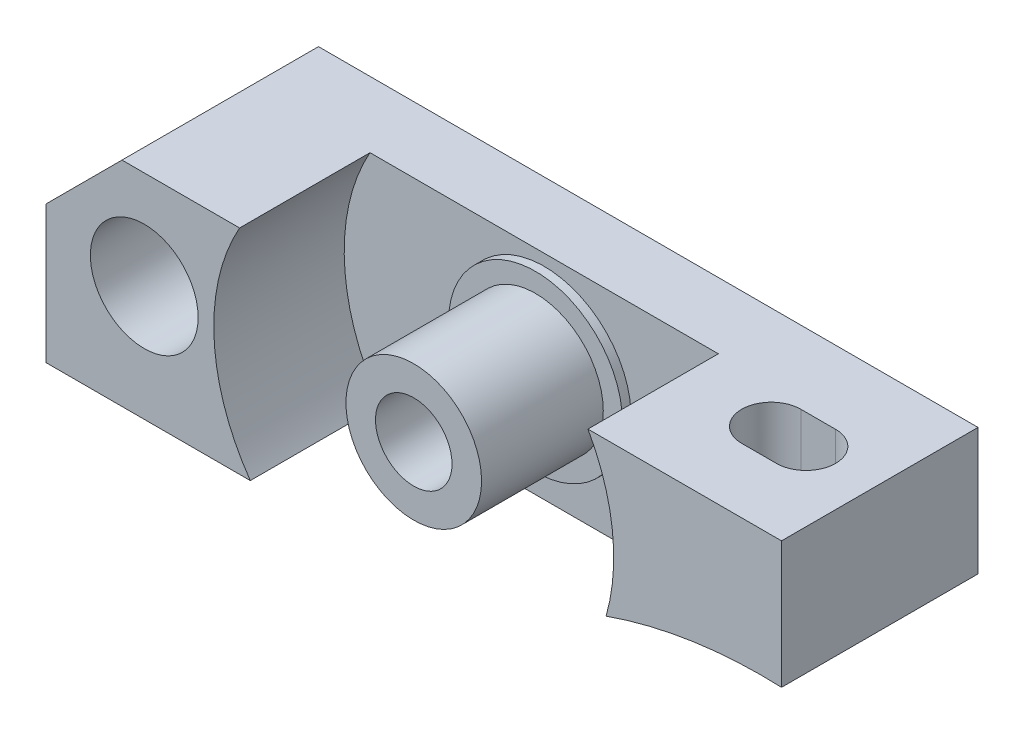
ISO-10303-21;
HEADER;
FILE_DESCRIPTION(('STEP AP214'),'2;1');
FILE_NAME('part.step','',(''),(''),'','','');
FILE_SCHEMA(('AUTOMOTIVE_DESIGN { 1 0 10303 214 1 1 1 1 }'));
ENDSEC;
DATA;
#1=APPLICATION_CONTEXT('core data for automotive mechanical design processes');
#2=APPLICATION_PROTOCOL_DEFINITION('international standard','automotive_design',2000,#1);
#3=PRODUCT_CONTEXT('',#1,'mechanical');
#4=PRODUCT('Part','Part','',(#3));
#5=PRODUCT_RELATED_PRODUCT_CATEGORY('part','',(#4));
#6=PRODUCT_DEFINITION_FORMATION('','',#4);
#7=PRODUCT_DEFINITION_CONTEXT('part definition',#1,'design');
#8=PRODUCT_DEFINITION('design','',#6,#7);
#9=PRODUCT_DEFINITION_SHAPE('','',#8);
#10=(LENGTH_UNIT() NAMED_UNIT(*) SI_UNIT(.MILLI.,.METRE.));
#11=(NAMED_UNIT(*) PLANE_ANGLE_UNIT() SI_UNIT($,.RADIAN.));
#12=(NAMED_UNIT(*) SI_UNIT($,.STERADIAN.) SOLID_ANGLE_UNIT());
#13=UNCERTAINTY_MEASURE_WITH_UNIT(LENGTH_MEASURE(1.E-05),#10,'distance_accuracy_value','');
#14=(GEOMETRIC_REPRESENTATION_CONTEXT(3) GLOBAL_UNCERTAINTY_ASSIGNED_CONTEXT((#13)) GLOBAL_UNIT_ASSIGNED_CONTEXT((#10,
#11,#12)) REPRESENTATION_CONTEXT('',''));
#15=CARTESIAN_POINT('',(0.,0.,0.));
#16=DIRECTION('',(0.,0.,1.));
#17=DIRECTION('',(1.,0.,0.));
#18=AXIS2_PLACEMENT_3D('',#15,#16,#17);
#19=CARTESIAN_POINT('',(-15.5,0.4875,3.8));
#20=DIRECTION('',(0.,0.,-1.));
#21=DIRECTION('',(-1.,0.,0.));
#22=AXIS2_PLACEMENT_3D('',#19,#20,#21);
#23=CYLINDRICAL_SURFACE('',#22,1.725);
#24=CARTESIAN_POINT('',(-15.5,0.4875,0.));
#25=DIRECTION('',(0.,0.,1.));
#26=DIRECTION('',(1.,0.,0.));
#27=AXIS2_PLACEMENT_3D('',#24,#25,#26);
#28=CIRCLE('',#27,1.725);
#29=CARTESIAN_POINT('',(-17.225,0.4875,0.));
#30=VERTEX_POINT('',#29);
#31=EDGE_CURVE('E235',#30,#30,#28,.T.);
#32=CARTESIAN_POINT('',(-15.5,0.4875,5.65));
#33=DIRECTION('',(0.,0.,1.));
#34=DIRECTION('',(1.,0.,0.));
#35=AXIS2_PLACEMENT_3D('',#32,#33,#34);
#36=CIRCLE('',#35,1.725);
#37=CARTESIAN_POINT('',(-17.225,0.4875,5.65));
#38=VERTEX_POINT('',#37);
#39=EDGE_CURVE('E202',#38,#38,#36,.T.);
#40=CARTESIAN_POINT('',(-17.225,0.4875,0.));
#41=CARTESIAN_POINT('',(-17.225,0.4875,0.0588541666666667));
#42=CARTESIAN_POINT('',(-17.225,0.4875,0.117708333333333));
#43=CARTESIAN_POINT('',(-17.225,0.4875,0.235416666666667));
#44=CARTESIAN_POINT('',(-17.225,0.4875,0.294270833333333));
#45=CARTESIAN_POINT('',(-17.225,0.4875,0.411979166666667));
#46=CARTESIAN_POINT('',(-17.225,0.4875,0.470833333333333));
#47=CARTESIAN_POINT('',(-17.225,0.4875,0.588541666666667));
#48=CARTESIAN_POINT('',(-17.225,0.4875,0.647395833333334));
#49=CARTESIAN_POINT('',(-17.225,0.4875,0.765104166666667));
#50=CARTESIAN_POINT('',(-17.225,0.4875,0.823958333333333));
#51=CARTESIAN_POINT('',(-17.225,0.4875,0.941666666666667));
#52=CARTESIAN_POINT('',(-17.225,0.4875,1.00052083333333));
#53=CARTESIAN_POINT('',(-17.225,0.4875,1.11822916666667));
#54=CARTESIAN_POINT('',(-17.225,0.4875,1.17708333333333));
#55=CARTESIAN_POINT('',(-17.225,0.4875,1.29479166666667));
#56=CARTESIAN_POINT('',(-17.225,0.4875,1.35364583333333));
#57=CARTESIAN_POINT('',(-17.225,0.4875,1.47135416666667));
#58=CARTESIAN_POINT('',(-17.225,0.4875,1.53020833333333));
#59=CARTESIAN_POINT('',(-17.225,0.4875,1.64791666666667));
#60=CARTESIAN_POINT('',(-17.225,0.4875,1.70677083333333));
#61=CARTESIAN_POINT('',(-17.225,0.4875,1.82447916666667));
#62=CARTESIAN_POINT('',(-17.225,0.4875,1.88333333333333));
#63=CARTESIAN_POINT('',(-17.225,0.4875,2.00104166666667));
#64=CARTESIAN_POINT('',(-17.225,0.4875,2.05989583333333));
#65=CARTESIAN_POINT('',(-17.225,0.4875,2.17760416666667));
#66=CARTESIAN_POINT('',(-17.225,0.4875,2.23645833333333));
#67=CARTESIAN_POINT('',(-17.225,0.4875,2.35416666666667));
#68=CARTESIAN_POINT('',(-17.225,0.4875,2.41302083333333));
#69=CARTESIAN_POINT('',(-17.225,0.4875,2.53072916666667));
#70=CARTESIAN_POINT('',(-17.225,0.4875,2.58958333333333));
#71=CARTESIAN_POINT('',(-17.225,0.4875,2.70729166666667));
#72=CARTESIAN_POINT('',(-17.225,0.4875,2.76614583333333));
#73=CARTESIAN_POINT('',(-17.225,0.4875,2.88385416666667));
#74=CARTESIAN_POINT('',(-17.225,0.4875,2.94270833333333));
#75=CARTESIAN_POINT('',(-17.225,0.4875,3.06041666666667));
#76=CARTESIAN_POINT('',(-17.225,0.4875,3.11927083333333));
#77=CARTESIAN_POINT('',(-17.225,0.4875,3.23697916666667));
#78=CARTESIAN_POINT('',(-17.225,0.4875,3.29583333333333));
#79=CARTESIAN_POINT('',(-17.225,0.4875,3.41354166666667));
#80=CARTESIAN_POINT('',(-17.225,0.4875,3.47239583333333));
#81=CARTESIAN_POINT('',(-17.225,0.4875,3.59010416666667));
#82=CARTESIAN_POINT('',(-17.225,0.4875,3.64895833333333));
#83=CARTESIAN_POINT('',(-17.225,0.4875,3.76666666666667));
#84=CARTESIAN_POINT('',(-17.225,0.4875,3.82552083333333));
#85=CARTESIAN_POINT('',(-17.225,0.4875,3.94322916666667));
#86=CARTESIAN_POINT('',(-17.225,0.4875,4.00208333333333));
#87=CARTESIAN_POINT('',(-17.225,0.4875,4.11979166666667));
#88=CARTESIAN_POINT('',(-17.225,0.4875,4.17864583333333));
#89=CARTESIAN_POINT('',(-17.225,0.4875,4.29635416666667));
#90=CARTESIAN_POINT('',(-17.225,0.4875,4.35520833333333));
#91=CARTESIAN_POINT('',(-17.225,0.4875,4.47291666666667));
#92=CARTESIAN_POINT('',(-17.225,0.4875,4.53177083333333));
#93=CARTESIAN_POINT('',(-17.225,0.4875,4.64947916666667));
#94=CARTESIAN_POINT('',(-17.225,0.4875,4.70833333333333));
#95=CARTESIAN_POINT('',(-17.225,0.4875,4.82604166666667));
#96=CARTESIAN_POINT('',(-17.225,0.4875,4.88489583333333));
#97=CARTESIAN_POINT('',(-17.225,0.4875,5.00260416666667));
#98=CARTESIAN_POINT('',(-17.225,0.4875,5.06145833333333));
#99=CARTESIAN_POINT('',(-17.225,0.4875,5.17916666666667));
#100=CARTESIAN_POINT('',(-17.225,0.4875,5.23802083333333));
#101=CARTESIAN_POINT('',(-17.225,0.4875,5.35572916666667));
#102=CARTESIAN_POINT('',(-17.225,0.4875,5.41458333333333));
#103=CARTESIAN_POINT('',(-17.225,0.4875,5.53229166666667));
#104=CARTESIAN_POINT('',(-17.225,0.4875,5.59114583333333));
#105=CARTESIAN_POINT('',(-17.225,0.4875,5.65));
#106=B_SPLINE_CURVE_WITH_KNOTS('',3,(#40,#41,#42,#43,#44,#45,#46,#47,#48,#49,#50,#51,#52,#53,
#54,#55,#56,#57,#58,#59,#60,#61,#62,#63,#64,#65,#66,#67,#68,#69,#70,#71,#72,#73,#74,#75,#76,#77,
#78,#79,#80,#81,#82,#83,#84,#85,#86,#87,#88,#89,#90,#91,#92,#93,#94,#95,#96,#97,#98,#99,#100,
#101,#102,#103,#104,#105),.UNSPECIFIED.,.F.,.F.,(4,2,2,2,2,2,2,2,2,2,2,2,2,2,2,2,2,2,2,2,2,2,2,
2,2,2,2,2,2,2,2,2,4),(0.,0.1765625,0.353125,0.5296875,0.70625,0.8828125,1.059375,1.2359375,
1.4125,1.5890625,1.765625,1.9421875,2.11875,2.2953125,2.471875,2.6484375,2.825,3.0015625,
3.178125,3.3546875,3.53125,3.7078125,3.884375,4.0609375,4.2375,4.4140625,4.590625,4.7671875,
4.94375,5.1203125,5.296875,5.4734375,5.65),.UNSPECIFIED.);
#107=EDGE_CURVE('BSEAM33',#30,#38,#106,.T.);
#108=ORIENTED_EDGE('',*,*,#31,.F.);
#109=ORIENTED_EDGE('',*,*,#39,.T.);
#110=ORIENTED_EDGE('',*,*,#107,.T.);
#111=ORIENTED_EDGE('',*,*,#107,.F.);
#112=EDGE_LOOP('',(#108,#110,#109,#111));
#113=FACE_BOUND('',#112,.T.);
#114=ADVANCED_FACE('F33',(#113),#23,.F.);
#115=CARTESIAN_POINT('',(0.,0.,3.8));
#116=DIRECTION('',(0.,0.,-1.));
#117=DIRECTION('',(-1.,0.,0.));
#118=AXIS2_PLACEMENT_3D('',#115,#116,#117);
#119=PLANE('',#118);
#120=CARTESIAN_POINT('',(0.,0.4875,3.8));
#121=DIRECTION('',(0.,0.,-1.));
#122=DIRECTION('',(-1.,0.,0.));
#123=AXIS2_PLACEMENT_3D('',#120,#121,#122);
#124=CIRCLE('',#123,5.);
#125=CARTESIAN_POINT('',(-4.99999999999999,0.4875,3.8));
#126=VERTEX_POINT('',#125);
#127=EDGE_CURVE('E281',#126,#126,#124,.F.);
#128=ORIENTED_EDGE('',*,*,#127,.F.);
#129=EDGE_LOOP('',(#128));
#130=FACE_BOUND('',#129,.T.);
#131=DIRECTION('',(1.,0.,0.));
#132=VECTOR('',#131,1.);
#133=CARTESIAN_POINT('',(-21.15,-6.1375,3.8));
#134=LINE('',#133,#132);
#135=CARTESIAN_POINT('',(-9.39996675526035,-6.1375,3.8));
#136=VERTEX_POINT('',#135);
#137=CARTESIAN_POINT('',(4.34141127376594,-6.13750000000001,3.8));
#138=VERTEX_POINT('',#137);
#139=EDGE_CURVE('E241',#136,#138,#134,.T.);
#140=ORIENTED_EDGE('',*,*,#139,.T.);
#141=CARTESIAN_POINT('',(19.9947662223094,-28.136874510538,3.8));
#142=DIRECTION('',(0.,0.,-1.));
#143=DIRECTION('',(-1.,0.,0.));
#144=AXIS2_PLACEMENT_3D('',#141,#142,#143);
#145=CIRCLE('',#144,27.);
#146=CARTESIAN_POINT('',(11.0615991158603,-2.6575,3.8));
#147=VERTEX_POINT('',#146);
#148=EDGE_CURVE('E180',#138,#147,#145,.T.);
#149=ORIENTED_EDGE('',*,*,#148,.T.);
#150=CARTESIAN_POINT('',(0.,0.4875,3.8));
#151=DIRECTION('',(0.,0.,-1.));
#152=DIRECTION('',(1.,0.,0.));
#153=AXIS2_PLACEMENT_3D('',#150,#151,#152);
#154=CIRCLE('',#153,11.5);
#155=CARTESIAN_POINT('',(10.0163616148779,6.1375,3.8));
#156=VERTEX_POINT('',#155);
#157=EDGE_CURVE('E209',#156,#147,#154,.T.);
#158=ORIENTED_EDGE('',*,*,#157,.F.);
#159=DIRECTION('',(-1.,0.,0.));
#160=VECTOR('',#159,1.);
#161=CARTESIAN_POINT('',(-16.78,6.1375,3.8));
#162=LINE('',#161,#160);
#163=CARTESIAN_POINT('',(-10.0163616148779,6.1375,3.8));
#164=VERTEX_POINT('',#163);
#165=EDGE_CURVE('E252',#156,#164,#162,.T.);
#166=ORIENTED_EDGE('',*,*,#165,.T.);
#167=CARTESIAN_POINT('',(0.,0.4875,3.8));
#168=DIRECTION('',(0.,0.,-1.));
#169=DIRECTION('',(1.,0.,0.));
#170=AXIS2_PLACEMENT_3D('',#167,#168,#169);
#171=CIRCLE('',#170,11.5);
#172=EDGE_CURVE('E218',#136,#164,#171,.T.);
#173=ORIENTED_EDGE('',*,*,#172,.F.);
#174=EDGE_LOOP('',(#140,#149,#158,#166,#173));
#175=FACE_BOUND('',#174,.T.);
#176=ADVANCED_FACE('F314',(#130,#175),#119,.F.);
#177=CARTESIAN_POINT('',(0.,0.,0.));
#178=DIRECTION('',(0.,0.,-1.));
#179=DIRECTION('',(-1.,0.,0.));
#180=AXIS2_PLACEMENT_3D('',#177,#178,#179);
#181=PLANE('',#180);
#182=CARTESIAN_POINT('',(19.9947662223094,-28.136874510538,0.));
#183=DIRECTION('',(0.,0.,1.));
#184=DIRECTION('',(1.,0.,0.));
#185=AXIS2_PLACEMENT_3D('',#182,#183,#184);
#186=CIRCLE('',#185,27.);
#187=CARTESIAN_POINT('',(21.15,-1.1616,0.));
#188=VERTEX_POINT('',#187);
#189=CARTESIAN_POINT('',(4.34141127376594,-6.13750000000001,0.));
#190=VERTEX_POINT('',#189);
#191=EDGE_CURVE('E168',#188,#190,#186,.T.);
#192=ORIENTED_EDGE('',*,*,#191,.T.);
#193=DIRECTION('',(1.,0.,0.));
#194=VECTOR('',#193,1.);
#195=CARTESIAN_POINT('',(-21.15,-6.1375,0.));
#196=LINE('',#195,#194);
#197=CARTESIAN_POINT('',(-21.15,-6.1375,0.));
#198=VERTEX_POINT('',#197);
#199=EDGE_CURVE('E263',#198,#190,#196,.T.);
#200=ORIENTED_EDGE('',*,*,#199,.F.);
#201=DIRECTION('',(0.,-1.,0.));
#202=VECTOR('',#201,1.);
#203=CARTESIAN_POINT('',(-21.15,-6.1375,0.));
#204=LINE('',#203,#202);
#205=CARTESIAN_POINT('',(-21.15,1.7675,0.));
#206=VERTEX_POINT('',#205);
#207=EDGE_CURVE('E260',#206,#198,#204,.T.);
#208=ORIENTED_EDGE('',*,*,#207,.F.);
#209=DIRECTION('',(-0.707106781186547,-0.707106781186548,0.));
#210=VECTOR('',#209,1.);
#211=CARTESIAN_POINT('',(-21.15,1.7675,0.));
#212=LINE('',#211,#210);
#213=CARTESIAN_POINT('',(-16.78,6.1375,0.));
#214=VERTEX_POINT('',#213);
#215=EDGE_CURVE('E270',#214,#206,#212,.T.);
#216=ORIENTED_EDGE('',*,*,#215,.F.);
#217=DIRECTION('',(-1.,0.,0.));
#218=VECTOR('',#217,1.);
#219=CARTESIAN_POINT('',(-16.78,6.1375,0.));
#220=LINE('',#219,#218);
#221=CARTESIAN_POINT('',(21.15,6.1375,0.));
#222=VERTEX_POINT('',#221);
#223=EDGE_CURVE('E268',#222,#214,#220,.T.);
#224=ORIENTED_EDGE('',*,*,#223,.F.);
#225=DIRECTION('',(0.,1.,0.));
#226=VECTOR('',#225,1.);
#227=CARTESIAN_POINT('',(21.15,-6.1375,0.));
#228=LINE('',#227,#226);
#229=EDGE_CURVE('E266',#188,#222,#228,.T.);
#230=ORIENTED_EDGE('',*,*,#229,.F.);
#231=EDGE_LOOP('',(#192,#200,#208,#216,#224,#230));
#232=FACE_BOUND('',#231,.T.);
#233=CARTESIAN_POINT('',(0.,0.4875,0.));
#234=DIRECTION('',(0.,0.,1.));
#235=DIRECTION('',(1.,0.,0.));
#236=AXIS2_PLACEMENT_3D('',#233,#234,#235);
#237=CIRCLE('',#236,2.2);
#238=CARTESIAN_POINT('',(2.20000000000001,0.4875,0.));
#239=VERTEX_POINT('',#238);
#240=EDGE_CURVE('E184',#239,#239,#237,.T.);
#241=ORIENTED_EDGE('',*,*,#240,.T.);
#242=EDGE_LOOP('',(#241));
#243=FACE_BOUND('',#242,.T.);
#244=ORIENTED_EDGE('',*,*,#31,.T.);
#245=EDGE_LOOP('',(#244));
#246=FACE_BOUND('',#245,.T.);
#247=ADVANCED_FACE('F320',(#232,#243,#246),#181,.T.);
#248=CARTESIAN_POINT('',(-21.15,-6.1375,3.8));
#249=DIRECTION('',(1.,0.,0.));
#250=DIRECTION('',(0.,0.,-1.));
#251=AXIS2_PLACEMENT_3D('',#248,#249,#250);
#252=PLANE('',#251);
#253=ORIENTED_EDGE('',*,*,#207,.T.);
#254=DIRECTION('',(0.,0.,-1.));
#255=VECTOR('',#254,1.);
#256=CARTESIAN_POINT('',(-21.15,-6.1375,3.8));
#257=LINE('',#256,#255);
#258=CARTESIAN_POINT('',(-21.15,-6.1375,11.3));
#259=VERTEX_POINT('',#258);
#260=EDGE_CURVE('E279',#259,#198,#257,.T.);
#261=ORIENTED_EDGE('',*,*,#260,.F.);
#262=DIRECTION('',(0.,-1.,0.));
#263=VECTOR('',#262,1.);
#264=CARTESIAN_POINT('',(-21.15,1.7675,11.3));
#265=LINE('',#264,#263);
#266=CARTESIAN_POINT('',(-21.15,1.7675,11.3));
#267=VERTEX_POINT('',#266);
#268=EDGE_CURVE('E222',#267,#259,#265,.T.);
#269=ORIENTED_EDGE('',*,*,#268,.F.);
#270=DIRECTION('',(0.,0.,-1.));
#271=VECTOR('',#270,1.);
#272=CARTESIAN_POINT('',(-21.15,1.7675,3.8));
#273=LINE('',#272,#271);
#274=EDGE_CURVE('E255',#267,#206,#273,.T.);
#275=ORIENTED_EDGE('',*,*,#274,.T.);
#276=EDGE_LOOP('',(#253,#261,#269,#275));
#277=FACE_BOUND('',#276,.T.);
#278=ADVANCED_FACE('F35',(#277),#252,.F.);
#279=CARTESIAN_POINT('',(-21.15,-6.1375,3.8));
#280=DIRECTION('',(0.,1.,0.));
#281=DIRECTION('',(0.,0.,1.));
#282=AXIS2_PLACEMENT_3D('',#279,#280,#281);
#283=PLANE('',#282);
#284=ORIENTED_EDGE('',*,*,#199,.T.);
#285=DIRECTION('',(0.,0.,1.));
#286=VECTOR('',#285,1.);
#287=CARTESIAN_POINT('',(4.34141127376594,-6.13750000000001,0.));
#288=LINE('',#287,#286);
#289=EDGE_CURVE('E173',#190,#138,#288,.T.);
#290=ORIENTED_EDGE('',*,*,#289,.T.);
#291=ORIENTED_EDGE('',*,*,#139,.F.);
#292=DIRECTION('',(0.,0.,-1.));
#293=VECTOR('',#292,1.);
#294=CARTESIAN_POINT('',(-9.39996675526035,-6.1375,11.3));
#295=LINE('',#294,#293);
#296=CARTESIAN_POINT('',(-9.39996675526035,-6.1375,11.3));
#297=VERTEX_POINT('',#296);
#298=EDGE_CURVE('E245',#297,#136,#295,.T.);
#299=ORIENTED_EDGE('',*,*,#298,.F.);
#300=DIRECTION('',(1.,0.,0.));
#301=VECTOR('',#300,1.);
#302=CARTESIAN_POINT('',(-21.15,-6.1375,11.3));
#303=LINE('',#302,#301);
#304=EDGE_CURVE('E225',#259,#297,#303,.T.);
#305=ORIENTED_EDGE('',*,*,#304,.F.);
#306=ORIENTED_EDGE('',*,*,#260,.T.);
#307=EDGE_LOOP('',(#284,#290,#291,#299,#305,#306));
#308=FACE_BOUND('',#307,.T.);
#309=ADVANCED_FACE('F341',(#308),#283,.F.);
#310=CARTESIAN_POINT('',(21.15,-6.1375,3.8));
#311=DIRECTION('',(-1.,0.,0.));
#312=DIRECTION('',(0.,0.,1.));
#313=AXIS2_PLACEMENT_3D('',#310,#311,#312);
#314=PLANE('',#313);
#315=DIRECTION('',(0.,1.,0.));
#316=VECTOR('',#315,1.);
#317=CARTESIAN_POINT('',(21.15,-6.1375,11.3));
#318=LINE('',#317,#316);
#319=CARTESIAN_POINT('',(21.15,-1.1616,11.3));
#320=VERTEX_POINT('',#319);
#321=CARTESIAN_POINT('',(21.15,6.1375,11.3));
#322=VERTEX_POINT('',#321);
#323=EDGE_CURVE('E208',#320,#322,#318,.T.);
#324=ORIENTED_EDGE('',*,*,#323,.F.);
#325=DIRECTION('',(0.,0.,1.));
#326=VECTOR('',#325,1.);
#327=CARTESIAN_POINT('',(21.15,-1.1616,0.));
#328=LINE('',#327,#326);
#329=EDGE_CURVE('E171',#188,#320,#328,.T.);
#330=ORIENTED_EDGE('',*,*,#329,.F.);
#331=ORIENTED_EDGE('',*,*,#229,.T.);
#332=DIRECTION('',(0.,0.,-1.));
#333=VECTOR('',#332,1.);
#334=CARTESIAN_POINT('',(21.15,6.1375,3.8));
#335=LINE('',#334,#333);
#336=EDGE_CURVE('E277',#322,#222,#335,.T.);
#337=ORIENTED_EDGE('',*,*,#336,.F.);
#338=EDGE_LOOP('',(#324,#330,#331,#337));
#339=FACE_BOUND('',#338,.T.);
#340=ADVANCED_FACE('F339',(#339),#314,.F.);
#341=CARTESIAN_POINT('',(-16.78,6.1375,3.8));
#342=DIRECTION('',(0.,-1.,0.));
#343=DIRECTION('',(0.,0.,-1.));
#344=AXIS2_PLACEMENT_3D('',#341,#342,#343);
#345=PLANE('',#344);
#346=DIRECTION('',(-1.,0.,0.));
#347=VECTOR('',#346,1.);
#348=CARTESIAN_POINT('',(17.15,6.1375,4.19));
#349=LINE('',#348,#347);
#350=CARTESIAN_POINT('',(17.15,6.1375,4.19));
#351=VERTEX_POINT('',#350);
#352=CARTESIAN_POINT('',(15.15,6.1375,4.19));
#353=VERTEX_POINT('',#352);
#354=EDGE_CURVE('E151',#351,#353,#349,.T.);
#355=ORIENTED_EDGE('',*,*,#354,.F.);
#356=CARTESIAN_POINT('',(17.15,6.1375,5.89));
#357=DIRECTION('',(0.,1.,0.));
#358=DIRECTION('',(0.,0.,1.));
#359=AXIS2_PLACEMENT_3D('',#356,#357,#358);
#360=CIRCLE('',#359,1.7);
#361=CARTESIAN_POINT('',(17.15,6.1375,7.59));
#362=VERTEX_POINT('',#361);
#363=EDGE_CURVE('E53',#362,#351,#360,.T.);
#364=ORIENTED_EDGE('',*,*,#363,.F.);
#365=DIRECTION('',(1.,0.,0.));
#366=VECTOR('',#365,1.);
#367=CARTESIAN_POINT('',(17.15,6.1375,7.59));
#368=LINE('',#367,#366);
#369=CARTESIAN_POINT('',(15.15,6.1375,7.59));
#370=VERTEX_POINT('',#369);
#371=EDGE_CURVE('E158',#370,#362,#368,.T.);
#372=ORIENTED_EDGE('',*,*,#371,.F.);
#373=CARTESIAN_POINT('',(15.15,6.1375,5.89));
#374=DIRECTION('',(0.,1.,0.));
#375=DIRECTION('',(0.,0.,1.));
#376=AXIS2_PLACEMENT_3D('',#373,#374,#375);
#377=CIRCLE('',#376,1.7);
#378=EDGE_CURVE('E142',#353,#370,#377,.T.);
#379=ORIENTED_EDGE('',*,*,#378,.F.);
#380=EDGE_LOOP('',(#355,#364,#372,#379));
#381=FACE_BOUND('',#380,.T.);
#382=ORIENTED_EDGE('',*,*,#223,.T.);
#383=DIRECTION('',(0.,0.,-1.));
#384=VECTOR('',#383,1.);
#385=CARTESIAN_POINT('',(-16.78,6.1375,3.8));
#386=LINE('',#385,#384);
#387=CARTESIAN_POINT('',(-16.78,6.1375,11.3));
#388=VERTEX_POINT('',#387);
#389=EDGE_CURVE('E274',#388,#214,#386,.T.);
#390=ORIENTED_EDGE('',*,*,#389,.F.);
#391=DIRECTION('',(-1.,0.,0.));
#392=VECTOR('',#391,1.);
#393=CARTESIAN_POINT('',(-10.0163616148779,6.1375,11.3));
#394=LINE('',#393,#392);
#395=CARTESIAN_POINT('',(-10.0163616148779,6.1375,11.3));
#396=VERTEX_POINT('',#395);
#397=EDGE_CURVE('E229',#396,#388,#394,.T.);
#398=ORIENTED_EDGE('',*,*,#397,.F.);
#399=DIRECTION('',(0.,0.,-1.));
#400=VECTOR('',#399,1.);
#401=CARTESIAN_POINT('',(-10.0163616148779,6.1375,11.3));
#402=LINE('',#401,#400);
#403=EDGE_CURVE('E232',#396,#164,#402,.T.);
#404=ORIENTED_EDGE('',*,*,#403,.T.);
#405=ORIENTED_EDGE('',*,*,#165,.F.);
#406=DIRECTION('',(0.,0.,-1.));
#407=VECTOR('',#406,1.);
#408=CARTESIAN_POINT('',(10.0163616148779,6.1375,11.3));
#409=LINE('',#408,#407);
#410=CARTESIAN_POINT('',(10.0163616148779,6.1375,11.3));
#411=VERTEX_POINT('',#410);
#412=EDGE_CURVE('E213',#411,#156,#409,.T.);
#413=ORIENTED_EDGE('',*,*,#412,.F.);
#414=DIRECTION('',(-1.,0.,0.));
#415=VECTOR('',#414,1.);
#416=CARTESIAN_POINT('',(21.15,6.1375,11.3));
#417=LINE('',#416,#415);
#418=EDGE_CURVE('E211',#322,#411,#417,.T.);
#419=ORIENTED_EDGE('',*,*,#418,.F.);
#420=ORIENTED_EDGE('',*,*,#336,.T.);
#421=EDGE_LOOP('',(#382,#390,#398,#404,#405,#413,#419,#420));
#422=FACE_BOUND('',#421,.T.);
#423=ADVANCED_FACE('F155',(#381,#422),#345,.F.);
#424=CARTESIAN_POINT('',(-21.15,1.7675,3.8));
#425=DIRECTION('',(0.707106781186548,-0.707106781186547,0.));
#426=DIRECTION('',(0.707106781186547,0.707106781186548,0.));
#427=AXIS2_PLACEMENT_3D('',#424,#425,#426);
#428=PLANE('',#427);
#429=ORIENTED_EDGE('',*,*,#215,.T.);
#430=ORIENTED_EDGE('',*,*,#274,.F.);
#431=DIRECTION('',(-0.707106781186547,-0.707106781186548,0.));
#432=VECTOR('',#431,1.);
#433=CARTESIAN_POINT('',(-16.78,6.1375,11.3));
#434=LINE('',#433,#432);
#435=EDGE_CURVE('E219',#388,#267,#434,.T.);
#436=ORIENTED_EDGE('',*,*,#435,.F.);
#437=ORIENTED_EDGE('',*,*,#389,.T.);
#438=EDGE_LOOP('',(#429,#430,#436,#437));
#439=FACE_BOUND('',#438,.T.);
#440=ADVANCED_FACE('F332',(#439),#428,.F.);
#441=CARTESIAN_POINT('',(0.,0.4875,11.3));
#442=DIRECTION('',(0.,0.,1.));
#443=DIRECTION('',(1.,0.,0.));
#444=AXIS2_PLACEMENT_3D('',#441,#442,#443);
#445=PLANE('',#444);
#446=CARTESIAN_POINT('',(-15.5,0.4875,11.3));
#447=DIRECTION('',(0.,0.,1.));
#448=DIRECTION('',(1.,0.,0.));
#449=AXIS2_PLACEMENT_3D('',#446,#447,#448);
#450=CIRCLE('',#449,3.1);
#451=CARTESIAN_POINT('',(-12.4,0.4875,11.3));
#452=VERTEX_POINT('',#451);
#453=EDGE_CURVE('E198',#452,#452,#450,.T.);
#454=ORIENTED_EDGE('',*,*,#453,.F.);
#455=EDGE_LOOP('',(#454));
#456=FACE_BOUND('',#455,.T.);
#457=ORIENTED_EDGE('',*,*,#435,.T.);
#458=ORIENTED_EDGE('',*,*,#268,.T.);
#459=ORIENTED_EDGE('',*,*,#304,.T.);
#460=CARTESIAN_POINT('',(0.,0.4875,11.3));
#461=DIRECTION('',(0.,0.,-1.));
#462=DIRECTION('',(1.,0.,0.));
#463=AXIS2_PLACEMENT_3D('',#460,#461,#462);
#464=CIRCLE('',#463,11.5);
#465=EDGE_CURVE('E227',#297,#396,#464,.T.);
#466=ORIENTED_EDGE('',*,*,#465,.T.);
#467=ORIENTED_EDGE('',*,*,#397,.T.);
#468=EDGE_LOOP('',(#457,#458,#459,#466,#467));
#469=FACE_BOUND('',#468,.T.);
#470=ADVANCED_FACE('F335',(#456,#469),#445,.T.);
#471=CARTESIAN_POINT('',(0.,0.4875,11.3));
#472=DIRECTION('',(0.,0.,-1.));
#473=DIRECTION('',(-1.,0.,0.));
#474=AXIS2_PLACEMENT_3D('',#471,#472,#473);
#475=CYLINDRICAL_SURFACE('',#474,11.5);
#476=ORIENTED_EDGE('',*,*,#172,.T.);
#477=ORIENTED_EDGE('',*,*,#403,.F.);
#478=ORIENTED_EDGE('',*,*,#465,.F.);
#479=ORIENTED_EDGE('',*,*,#298,.T.);
#480=EDGE_LOOP('',(#476,#477,#478,#479));
#481=FACE_BOUND('',#480,.T.);
#482=ADVANCED_FACE('F326',(#481),#475,.F.);
#483=CARTESIAN_POINT('',(0.,0.4875,11.3));
#484=DIRECTION('',(0.,0.,-1.));
#485=DIRECTION('',(-1.,0.,0.));
#486=AXIS2_PLACEMENT_3D('',#483,#484,#485);
#487=CYLINDRICAL_SURFACE('',#486,11.5);
#488=ORIENTED_EDGE('',*,*,#157,.T.);
#489=DIRECTION('',(0.,0.,1.));
#490=VECTOR('',#489,1.);
#491=CARTESIAN_POINT('',(11.0615991158603,-2.6575,5.65));
#492=LINE('',#491,#490);
#493=CARTESIAN_POINT('',(11.0615991158603,-2.6575,11.3));
#494=VERTEX_POINT('',#493);
#495=EDGE_CURVE('E176',#147,#494,#492,.T.);
#496=ORIENTED_EDGE('',*,*,#495,.T.);
#497=CARTESIAN_POINT('',(0.,0.4875,11.3));
#498=DIRECTION('',(0.,0.,-1.));
#499=DIRECTION('',(1.,0.,0.));
#500=AXIS2_PLACEMENT_3D('',#497,#498,#499);
#501=CIRCLE('',#500,11.5);
#502=EDGE_CURVE('E205',#411,#494,#501,.T.);
#503=ORIENTED_EDGE('',*,*,#502,.F.);
#504=ORIENTED_EDGE('',*,*,#412,.T.);
#505=EDGE_LOOP('',(#488,#496,#503,#504));
#506=FACE_BOUND('',#505,.T.);
#507=ADVANCED_FACE('F366',(#506),#487,.F.);
#508=CARTESIAN_POINT('',(0.,0.4875,11.3));
#509=DIRECTION('',(0.,0.,1.));
#510=DIRECTION('',(1.,0.,0.));
#511=AXIS2_PLACEMENT_3D('',#508,#509,#510);
#512=PLANE('',#511);
#513=CARTESIAN_POINT('',(19.9947662223094,-28.136874510538,11.3));
#514=DIRECTION('',(0.,0.,1.));
#515=DIRECTION('',(1.,0.,0.));
#516=AXIS2_PLACEMENT_3D('',#513,#514,#515);
#517=CIRCLE('',#516,27.);
#518=EDGE_CURVE('E165',#320,#494,#517,.T.);
#519=ORIENTED_EDGE('',*,*,#518,.F.);
#520=ORIENTED_EDGE('',*,*,#323,.T.);
#521=ORIENTED_EDGE('',*,*,#418,.T.);
#522=ORIENTED_EDGE('',*,*,#502,.T.);
#523=EDGE_LOOP('',(#519,#520,#521,#522));
#524=FACE_BOUND('',#523,.T.);
#525=ADVANCED_FACE('F362',(#524),#512,.T.);
#526=CARTESIAN_POINT('',(-15.5,0.4875,5.65));
#527=DIRECTION('',(0.,0.,1.));
#528=DIRECTION('',(1.,0.,0.));
#529=AXIS2_PLACEMENT_3D('',#526,#527,#528);
#530=CYLINDRICAL_SURFACE('',#529,3.1);
#531=CARTESIAN_POINT('',(-15.5,0.4875,5.65));
#532=DIRECTION('',(0.,0.,1.));
#533=DIRECTION('',(1.,0.,0.));
#534=AXIS2_PLACEMENT_3D('',#531,#532,#533);
#535=CIRCLE('',#534,3.1);
#536=CARTESIAN_POINT('',(-12.4,0.4875,5.65));
#537=VERTEX_POINT('',#536);
#538=EDGE_CURVE('E199',#537,#537,#535,.T.);
#539=ORIENTED_EDGE('',*,*,#538,.F.);
#540=EDGE_LOOP('',(#539));
#541=FACE_BOUND('',#540,.T.);
#542=ORIENTED_EDGE('',*,*,#453,.T.);
#543=EDGE_LOOP('',(#542));
#544=FACE_BOUND('',#543,.T.);
#545=ADVANCED_FACE('F388',(#541,#544),#530,.F.);
#546=CARTESIAN_POINT('',(-15.5,0.4875,5.65));
#547=DIRECTION('',(0.,0.,1.));
#548=DIRECTION('',(1.,0.,0.));
#549=AXIS2_PLACEMENT_3D('',#546,#547,#548);
#550=PLANE('',#549);
#551=ORIENTED_EDGE('',*,*,#39,.F.);
#552=EDGE_LOOP('',(#551));
#553=FACE_BOUND('',#552,.T.);
#554=ORIENTED_EDGE('',*,*,#538,.T.);
#555=EDGE_LOOP('',(#554));
#556=FACE_BOUND('',#555,.T.);
#557=ADVANCED_FACE('F391',(#553,#556),#550,.T.);
#558=CARTESIAN_POINT('',(0.,0.4875,4.3));
#559=DIRECTION('',(0.,0.,-1.));
#560=DIRECTION('',(-1.,0.,0.));
#561=AXIS2_PLACEMENT_3D('',#558,#559,#560);
#562=CYLINDRICAL_SURFACE('',#561,5.);
#563=CARTESIAN_POINT('',(0.,0.4875,4.3));
#564=DIRECTION('',(0.,0.,1.));
#565=DIRECTION('',(1.,0.,0.));
#566=AXIS2_PLACEMENT_3D('',#563,#564,#565);
#567=CIRCLE('',#566,5.);
#568=CARTESIAN_POINT('',(5.00000000000001,0.4875,4.3));
#569=VERTEX_POINT('',#568);
#570=EDGE_CURVE('E193',#569,#569,#567,.T.);
#571=ORIENTED_EDGE('',*,*,#570,.F.);
#572=EDGE_LOOP('',(#571));
#573=FACE_BOUND('',#572,.T.);
#574=ORIENTED_EDGE('',*,*,#127,.T.);
#575=EDGE_LOOP('',(#574));
#576=FACE_BOUND('',#575,.T.);
#577=ADVANCED_FACE('F395',(#573,#576),#562,.T.);
#578=CARTESIAN_POINT('',(0.,0.4875,4.3));
#579=DIRECTION('',(0.,0.,1.));
#580=DIRECTION('',(1.,0.,0.));
#581=AXIS2_PLACEMENT_3D('',#578,#579,#580);
#582=PLANE('',#581);
#583=CARTESIAN_POINT('',(0.,0.4875,4.3));
#584=DIRECTION('',(0.,0.,1.));
#585=DIRECTION('',(1.,0.,0.));
#586=AXIS2_PLACEMENT_3D('',#583,#584,#585);
#587=CIRCLE('',#586,3.9);
#588=CARTESIAN_POINT('',(3.90000000000001,0.4875,4.3));
#589=VERTEX_POINT('',#588);
#590=EDGE_CURVE('E187',#589,#589,#587,.T.);
#591=ORIENTED_EDGE('',*,*,#590,.F.);
#592=EDGE_LOOP('',(#591));
#593=FACE_BOUND('',#592,.T.);
#594=ORIENTED_EDGE('',*,*,#570,.T.);
#595=EDGE_LOOP('',(#594));
#596=FACE_BOUND('',#595,.T.);
#597=ADVANCED_FACE('F399',(#593,#596),#582,.T.);
#598=CARTESIAN_POINT('',(0.,0.4875,11.3));
#599=DIRECTION('',(0.,0.,-1.));
#600=DIRECTION('',(-1.,0.,0.));
#601=AXIS2_PLACEMENT_3D('',#598,#599,#600);
#602=CYLINDRICAL_SURFACE('',#601,3.9);
#603=CARTESIAN_POINT('',(0.,0.4875,11.3));
#604=DIRECTION('',(0.,0.,1.));
#605=DIRECTION('',(1.,0.,0.));
#606=AXIS2_PLACEMENT_3D('',#603,#604,#605);
#607=CIRCLE('',#606,3.9);
#608=CARTESIAN_POINT('',(3.90000000000001,0.4875,11.3));
#609=VERTEX_POINT('',#608);
#610=EDGE_CURVE('E190',#609,#609,#607,.T.);
#611=ORIENTED_EDGE('',*,*,#610,.F.);
#612=EDGE_LOOP('',(#611));
#613=FACE_BOUND('',#612,.T.);
#614=ORIENTED_EDGE('',*,*,#590,.T.);
#615=EDGE_LOOP('',(#614));
#616=FACE_BOUND('',#615,.T.);
#617=ADVANCED_FACE('F403',(#613,#616),#602,.T.);
#618=CARTESIAN_POINT('',(0.,0.4875,11.3));
#619=DIRECTION('',(0.,0.,1.));
#620=DIRECTION('',(1.,0.,0.));
#621=AXIS2_PLACEMENT_3D('',#618,#619,#620);
#622=PLANE('',#621);
#623=CARTESIAN_POINT('',(0.,0.4875,11.3));
#624=DIRECTION('',(0.,0.,1.));
#625=DIRECTION('',(1.,0.,0.));
#626=AXIS2_PLACEMENT_3D('',#623,#624,#625);
#627=CIRCLE('',#626,2.2);
#628=CARTESIAN_POINT('',(2.20000000000001,0.4875,11.3));
#629=VERTEX_POINT('',#628);
#630=EDGE_CURVE('E183',#629,#629,#627,.T.);
#631=ORIENTED_EDGE('',*,*,#630,.F.);
#632=EDGE_LOOP('',(#631));
#633=FACE_BOUND('',#632,.T.);
#634=ORIENTED_EDGE('',*,*,#610,.T.);
#635=EDGE_LOOP('',(#634));
#636=FACE_BOUND('',#635,.T.);
#637=ADVANCED_FACE('F407',(#633,#636),#622,.T.);
#638=CARTESIAN_POINT('',(0.,0.4875,0.));
#639=DIRECTION('',(0.,0.,1.));
#640=DIRECTION('',(1.,0.,0.));
#641=AXIS2_PLACEMENT_3D('',#638,#639,#640);
#642=CYLINDRICAL_SURFACE('',#641,2.2);
#643=ORIENTED_EDGE('',*,*,#240,.F.);
#644=EDGE_LOOP('',(#643));
#645=FACE_BOUND('',#644,.T.);
#646=ORIENTED_EDGE('',*,*,#630,.T.);
#647=EDGE_LOOP('',(#646));
#648=FACE_BOUND('',#647,.T.);
#649=ADVANCED_FACE('F311',(#645,#648),#642,.F.);
#650=CARTESIAN_POINT('',(19.9947662223094,-28.136874510538,0.));
#651=DIRECTION('',(0.,0.,1.));
#652=DIRECTION('',(1.,0.,0.));
#653=AXIS2_PLACEMENT_3D('',#650,#651,#652);
#654=CYLINDRICAL_SURFACE('',#653,27.);
#655=CARTESIAN_POINT('',(19.9947662223094,-28.136874510538,7.59));
#656=DIRECTION('',(0.,0.,1.));
#657=DIRECTION('',(1.,0.,0.));
#658=AXIS2_PLACEMENT_3D('',#655,#656,#657);
#659=CIRCLE('',#658,27.);
#660=CARTESIAN_POINT('',(15.15,-1.5750929390551,7.59));
#661=VERTEX_POINT('',#660);
#662=CARTESIAN_POINT('',(17.15,-1.28715747030821,7.59));
#663=VERTEX_POINT('',#662);
#664=EDGE_CURVE('E46',#661,#663,#659,.F.);
#665=ORIENTED_EDGE('',*,*,#664,.T.);
#666=CARTESIAN_POINT('',(17.15,-1.2871574703082,7.59));
#667=CARTESIAN_POINT('',(17.1977649100459,-1.28209599731693,7.58999959424898));
#668=CARTESIAN_POINT('',(17.2455211533958,-1.27716592183027,7.58798562764703));
#669=CARTESIAN_POINT('',(17.3407223849955,-1.26759214467781,7.57994362731799));
#670=CARTESIAN_POINT('',(17.3881673784443,-1.26294843821761,7.57391566081325));
#671=CARTESIAN_POINT('',(17.5294616943076,-1.24949487664709,7.54985328753206));
#672=CARTESIAN_POINT('',(17.6224091432885,-1.24114791660823,7.52584031458761));
#673=CARTESIAN_POINT('',(17.8030561012645,-1.22582373742053,7.46248136535262));
#674=CARTESIAN_POINT('',(17.8907523450145,-1.21884736449024,7.4231259609077));
#675=CARTESIAN_POINT('',(18.0583354989652,-1.20627300664316,7.33017343313658));
#676=CARTESIAN_POINT('',(18.1382245044454,-1.20067465128284,7.27658014536111));
#677=CARTESIAN_POINT('',(18.287613605107,-1.19079451212358,7.15687278098713));
#678=CARTESIAN_POINT('',(18.3571496336681,-1.18650811730724,7.0908039068255));
#679=CARTESIAN_POINT('',(18.4841784507844,-1.17908930022077,6.9478796848151));
#680=CARTESIAN_POINT('',(18.5416692966344,-1.17595706403719,6.87102260032489));
#681=CARTESIAN_POINT('',(18.6428344007898,-1.1706947451825,6.7088769670289));
#682=CARTESIAN_POINT('',(18.6865354015256,-1.16856271886089,6.62360516383589));
#683=CARTESIAN_POINT('',(18.7590192767906,-1.16514387417654,6.44693184291034));
#684=CARTESIAN_POINT('',(18.787803197879,-1.16385699651781,6.35553075570711));
#685=CARTESIAN_POINT('',(18.8296325473814,-1.16201757849669,6.16919743372129));
#686=CARTESIAN_POINT('',(18.8426794231435,-1.16146497060249,6.07426552449903));
#687=CARTESIAN_POINT('',(18.8526674084776,-1.16104020580526,5.88355430849598));
#688=CARTESIAN_POINT('',(18.8496081154647,-1.161168065911,5.78777498059311));
#689=CARTESIAN_POINT('',(18.8274685917262,-1.16211711599343,5.59807667943008));
#690=CARTESIAN_POINT('',(18.8083862260404,-1.16293839836377,5.50415795578925));
#691=CARTESIAN_POINT('',(18.7547428227561,-1.16535143872098,5.32086099157048));
#692=CARTESIAN_POINT('',(18.7201818606697,-1.16694319294912,5.23148272884436));
#693=CARTESIAN_POINT('',(18.636572363916,-1.17102476541327,5.05980856543177));
#694=CARTESIAN_POINT('',(18.5875245456936,-1.17351453923921,4.9775123147655));
#695=CARTESIAN_POINT('',(18.4763499875161,-1.179547117879,4.82233679079949));
#696=CARTESIAN_POINT('',(18.4142239119675,-1.18308986920285,4.74945703942257));
#697=CARTESIAN_POINT('',(18.2786954100704,-1.19137954699202,4.61518851074199));
#698=CARTESIAN_POINT('',(18.2052956764933,-1.1961261860784,4.55379699716096));
#699=CARTESIAN_POINT('',(18.0492912062614,-1.2069426681128,4.44419111984482));
#700=CARTESIAN_POINT('',(17.966683727128,-1.21301290580525,4.39598069687071));
#701=CARTESIAN_POINT('',(17.7945429136055,-1.22653295365087,4.31403286217333));
#702=CARTESIAN_POINT('',(17.704999046096,-1.23398488684542,4.28031799179012));
#703=CARTESIAN_POINT('',(17.521710760206,-1.25021570128548,4.22841176616968));
#704=CARTESIAN_POINT('',(17.4279725770976,-1.2589926560313,4.21019812421116));
#705=CARTESIAN_POINT('',(17.3030358348863,-1.27136612431998,4.19662234160158));
#706=CARTESIAN_POINT('',(17.2724455453819,-1.27444866018684,4.19413714475434));
#707=CARTESIAN_POINT('',(17.2112391251296,-1.28072219368319,4.19082825244158));
#708=CARTESIAN_POINT('',(17.1806231273854,-1.28391299740821,4.19000173111598));
#709=CARTESIAN_POINT('',(17.15,-1.28715747030821,4.19));
#710=B_SPLINE_CURVE_WITH_KNOTS('',3,(#666,#667,#668,#669,#670,#671,#672,#673,#674,#675,#676,
#677,#678,#679,#680,#681,#682,#683,#684,#685,#686,#687,#688,#689,#690,#691,#692,#693,#694,#695,
#696,#697,#698,#699,#700,#701,#702,#703,#704,#705,#706,#707,#708,#709),.UNSPECIFIED.,.F.,.F.,(4,
2,2,2,2,2,2,2,2,2,2,2,2,2,2,2,2,2,2,2,2,4),(0.,0.1440096678076,0.288016923950343,
0.575618051744516,0.863396194046917,1.15109689012102,1.43777450429216,1.72449831967543,
2.01066262928357,2.29680685932987,2.58292477046613,2.86904983335226,3.15521302641543,
3.4413748234523,3.72752247077747,4.01365558462768,4.29972046008583,4.58587076729459,
4.87246445771747,5.15864540175304,5.25115002490308,5.34349691509356),.UNSPECIFIED.);
#711=CARTESIAN_POINT('',(17.15,-1.28715747030821,4.19));
#712=VERTEX_POINT('',#711);
#713=EDGE_CURVE('E11',#663,#712,#710,.T.);
#714=ORIENTED_EDGE('',*,*,#713,.T.);
#715=CARTESIAN_POINT('',(19.9947662223094,-28.136874510538,4.19));
#716=DIRECTION('',(0.,0.,-1.));
#717=DIRECTION('',(-1.,0.,0.));
#718=AXIS2_PLACEMENT_3D('',#715,#716,#717);
#719=CIRCLE('',#718,27.);
#720=CARTESIAN_POINT('',(15.15,-1.5750929390551,4.19));
#721=VERTEX_POINT('',#720);
#722=EDGE_CURVE('E285',#712,#721,#719,.F.);
#723=ORIENTED_EDGE('',*,*,#722,.T.);
#724=CARTESIAN_POINT('',(15.15,-1.5750929390551,4.19));
#725=CARTESIAN_POINT('',(15.1012811606367,-1.58397829220377,4.19000070051193));
#726=CARTESIAN_POINT('',(15.0526112302419,-1.59299494506183,4.19209548310917));
#727=CARTESIAN_POINT('',(14.9556703703969,-1.61122768289099,4.20044228461182));
#728=CARTESIAN_POINT('',(14.9073994126193,-1.62044375353226,4.20669400575982));
#729=CARTESIAN_POINT('',(14.7637574927211,-1.64827286584067,4.23161586929853));
#730=CARTESIAN_POINT('',(14.6694224161283,-1.66709148766338,4.25645289776437));
#731=CARTESIAN_POINT('',(14.4863615842458,-1.70457917474862,4.32186476998643));
#732=CARTESIAN_POINT('',(14.3976378062171,-1.72324818529103,4.3624451257011));
#733=CARTESIAN_POINT('',(14.2282854230208,-1.75970253123904,4.45825310390447));
#734=CARTESIAN_POINT('',(14.1476553534204,-1.77748802620805,4.51347807006572));
#735=CARTESIAN_POINT('',(13.9969719167253,-1.81136542337726,4.63700326228442));
#736=CARTESIAN_POINT('',(13.9268987861026,-1.82746047268592,4.70527849918968));
#737=CARTESIAN_POINT('',(13.7992690696047,-1.8572222992006,4.85314816354977));
#738=CARTESIAN_POINT('',(13.7417128785167,-1.87088899981345,4.93274294789493));
#739=CARTESIAN_POINT('',(13.6419744078503,-1.89483522102442,5.09936581179174));
#740=CARTESIAN_POINT('',(13.5995142129327,-1.90517559700177,5.18621866829941));
#741=CARTESIAN_POINT('',(13.5298456649921,-1.92225838121878,5.36616526041785));
#742=CARTESIAN_POINT('',(13.5026337476764,-1.92900163027097,5.45925753186121));
#743=CARTESIAN_POINT('',(13.4649208459249,-1.93837284560911,5.64634323896537));
#744=CARTESIAN_POINT('',(13.4539888214159,-1.94110693052868,5.74024460242169));
#745=CARTESIAN_POINT('',(13.4478289727302,-1.94264566704589,5.92859022224872));
#746=CARTESIAN_POINT('',(13.4525997648436,-1.94145066486915,6.02303443005266));
#747=CARTESIAN_POINT('',(13.4774912141291,-1.93524701929711,6.20831363105192));
#748=CARTESIAN_POINT('',(13.4973835934513,-1.93029509317422,6.29918135644411));
#749=CARTESIAN_POINT('',(13.5515929685057,-1.9169147186319,6.47623142494426));
#750=CARTESIAN_POINT('',(13.5859103496046,-1.90848617733415,6.5624136428085));
#751=CARTESIAN_POINT('',(13.6682500280692,-1.88850324201592,6.72850053281424));
#752=CARTESIAN_POINT('',(13.7163884054689,-1.87692241723492,6.80834439642859));
#753=CARTESIAN_POINT('',(13.8247984177483,-1.85123981199166,6.95885208503751));
#754=CARTESIAN_POINT('',(13.885070893685,-1.8371378567886,7.02951527312836));
#755=CARTESIAN_POINT('',(14.0176810642312,-1.8066791885231,7.16154405819825));
#756=CARTESIAN_POINT('',(14.0902814997849,-1.7902751290397,7.22263477634711));
#757=CARTESIAN_POINT('',(14.2444417857559,-1.7561998921638,7.33183588257773));
#758=CARTESIAN_POINT('',(14.326005719028,-1.7385281386225,7.37994032066453));
#759=CARTESIAN_POINT('',(14.497923087453,-1.70218860388049,7.46293729998399));
#760=CARTESIAN_POINT('',(14.5884417995089,-1.68350705834609,7.49748085488801));
#761=CARTESIAN_POINT('',(14.7739726297783,-1.646268152684,7.55068887202361));
#762=CARTESIAN_POINT('',(14.868977826946,-1.62771064863718,7.56937699990873));
#763=CARTESIAN_POINT('',(14.9955796206019,-1.60370420336065,7.5832562898742));
#764=CARTESIAN_POINT('',(15.0264240900484,-1.59791129060876,7.58578574716583));
#765=CARTESIAN_POINT('',(15.0881716059513,-1.58642612863936,7.58915537978913));
#766=CARTESIAN_POINT('',(15.1190744745049,-1.58073373048938,7.58999830690756));
#767=CARTESIAN_POINT('',(15.15,-1.5750929390551,7.59));
#768=B_SPLINE_CURVE_WITH_KNOTS('',3,(#724,#725,#726,#727,#728,#729,#730,#731,#732,#733,#734,
#735,#736,#737,#738,#739,#740,#741,#742,#743,#744,#745,#746,#747,#748,#749,#750,#751,#752,#753,
#754,#755,#756,#757,#758,#759,#760,#761,#762,#763,#764,#765,#766,#767),.UNSPECIFIED.,.F.,.F.,(4,
2,2,2,2,2,2,2,2,2,2,2,2,2,2,2,2,2,2,2,2,4),(0.,0.148474656116451,0.296938678285301,
0.593460053562884,0.890085338936356,1.18665685739164,1.48266607768042,1.77868463281727,
2.0689306050263,2.35910870375952,2.64145804080211,2.92378249828529,3.20192755410801,
3.48008004110201,3.76064067331377,4.04122075886541,4.32877758701646,4.61646594390124,
4.91113646936423,5.2053663948549,5.29979054367884,5.39406050154171),.UNSPECIFIED.);
#769=EDGE_CURVE('E145',#721,#661,#768,.T.);
#770=ORIENTED_EDGE('',*,*,#769,.T.);
#771=EDGE_LOOP('',(#665,#714,#723,#770));
#772=FACE_BOUND('',#771,.T.);
#773=ORIENTED_EDGE('',*,*,#289,.F.);
#774=ORIENTED_EDGE('',*,*,#191,.F.);
#775=ORIENTED_EDGE('',*,*,#329,.T.);
#776=ORIENTED_EDGE('',*,*,#518,.T.);
#777=ORIENTED_EDGE('',*,*,#495,.F.);
#778=ORIENTED_EDGE('',*,*,#148,.F.);
#779=EDGE_LOOP('',(#773,#774,#775,#776,#777,#778));
#780=FACE_BOUND('',#779,.T.);
#781=ADVANCED_FACE('F294',(#772,#780),#654,.F.);
#782=CARTESIAN_POINT('',(17.15,-6.13755,5.89));
#783=DIRECTION('',(0.,1.,0.));
#784=DIRECTION('',(0.,0.,1.));
#785=AXIS2_PLACEMENT_3D('',#782,#783,#784);
#786=CYLINDRICAL_SURFACE('',#785,1.7);
#787=DIRECTION('',(0.,1.,0.));
#788=VECTOR('',#787,1.);
#789=CARTESIAN_POINT('',(17.15,-6.13755,7.59));
#790=LINE('',#789,#788);
#791=EDGE_CURVE('E163',#663,#362,#790,.T.);
#792=ORIENTED_EDGE('',*,*,#791,.T.);
#793=ORIENTED_EDGE('',*,*,#363,.T.);
#794=DIRECTION('',(0.,1.,0.));
#795=VECTOR('',#794,1.);
#796=CARTESIAN_POINT('',(17.15,-6.13755,4.19));
#797=LINE('',#796,#795);
#798=EDGE_CURVE('E148',#712,#351,#797,.T.);
#799=ORIENTED_EDGE('',*,*,#798,.F.);
#800=ORIENTED_EDGE('',*,*,#713,.F.);
#801=EDGE_LOOP('',(#792,#793,#799,#800));
#802=FACE_BOUND('',#801,.T.);
#803=ADVANCED_FACE('F303',(#802),#786,.F.);
#804=CARTESIAN_POINT('',(17.15,-6.13755,7.59));
#805=DIRECTION('',(0.,0.,1.));
#806=DIRECTION('',(1.,0.,0.));
#807=AXIS2_PLACEMENT_3D('',#804,#805,#806);
#808=PLANE('',#807);
#809=DIRECTION('',(0.,1.,0.));
#810=VECTOR('',#809,1.);
#811=CARTESIAN_POINT('',(15.15,-6.13755,7.59));
#812=LINE('',#811,#810);
#813=EDGE_CURVE('E147',#661,#370,#812,.T.);
#814=ORIENTED_EDGE('',*,*,#813,.T.);
#815=ORIENTED_EDGE('',*,*,#371,.T.);
#816=ORIENTED_EDGE('',*,*,#791,.F.);
#817=ORIENTED_EDGE('',*,*,#664,.F.);
#818=EDGE_LOOP('',(#814,#815,#816,#817));
#819=FACE_BOUND('',#818,.T.);
#820=ADVANCED_FACE('F301',(#819),#808,.F.);
#821=CARTESIAN_POINT('',(15.15,-6.13755,5.89));
#822=DIRECTION('',(0.,1.,0.));
#823=DIRECTION('',(0.,0.,1.));
#824=AXIS2_PLACEMENT_3D('',#821,#822,#823);
#825=CYLINDRICAL_SURFACE('',#824,1.7);
#826=DIRECTION('',(0.,1.,0.));
#827=VECTOR('',#826,1.);
#828=CARTESIAN_POINT('',(15.15,-6.13755,4.19));
#829=LINE('',#828,#827);
#830=EDGE_CURVE('E61',#721,#353,#829,.T.);
#831=ORIENTED_EDGE('',*,*,#830,.T.);
#832=ORIENTED_EDGE('',*,*,#378,.T.);
#833=ORIENTED_EDGE('',*,*,#813,.F.);
#834=ORIENTED_EDGE('',*,*,#769,.F.);
#835=EDGE_LOOP('',(#831,#832,#833,#834));
#836=FACE_BOUND('',#835,.T.);
#837=ADVANCED_FACE('F139',(#836),#825,.F.);
#838=CARTESIAN_POINT('',(17.15,-6.13755,4.19));
#839=DIRECTION('',(0.,0.,-1.));
#840=DIRECTION('',(-1.,0.,0.));
#841=AXIS2_PLACEMENT_3D('',#838,#839,#840);
#842=PLANE('',#841);
#843=ORIENTED_EDGE('',*,*,#798,.T.);
#844=ORIENTED_EDGE('',*,*,#354,.T.);
#845=ORIENTED_EDGE('',*,*,#830,.F.);
#846=ORIENTED_EDGE('',*,*,#722,.F.);
#847=EDGE_LOOP('',(#843,#844,#845,#846));
#848=FACE_BOUND('',#847,.T.);
#849=ADVANCED_FACE('F152',(#848),#842,.F.);
#850=CLOSED_SHELL('',(#114,#176,#247,#278,#309,#340,#423,#440,#470,#482,#507,#525,#545,#557,
#577,#597,#617,#637,#649,#781,#803,#820,#837,#849));
#851=MANIFOLD_SOLID_BREP('B2',#850);
#852=ADVANCED_BREP_SHAPE_REPRESENTATION('',(#18,#851),#14);
#853=SHAPE_DEFINITION_REPRESENTATION(#9,#852);
ENDSEC;
END-ISO-10303-21;
